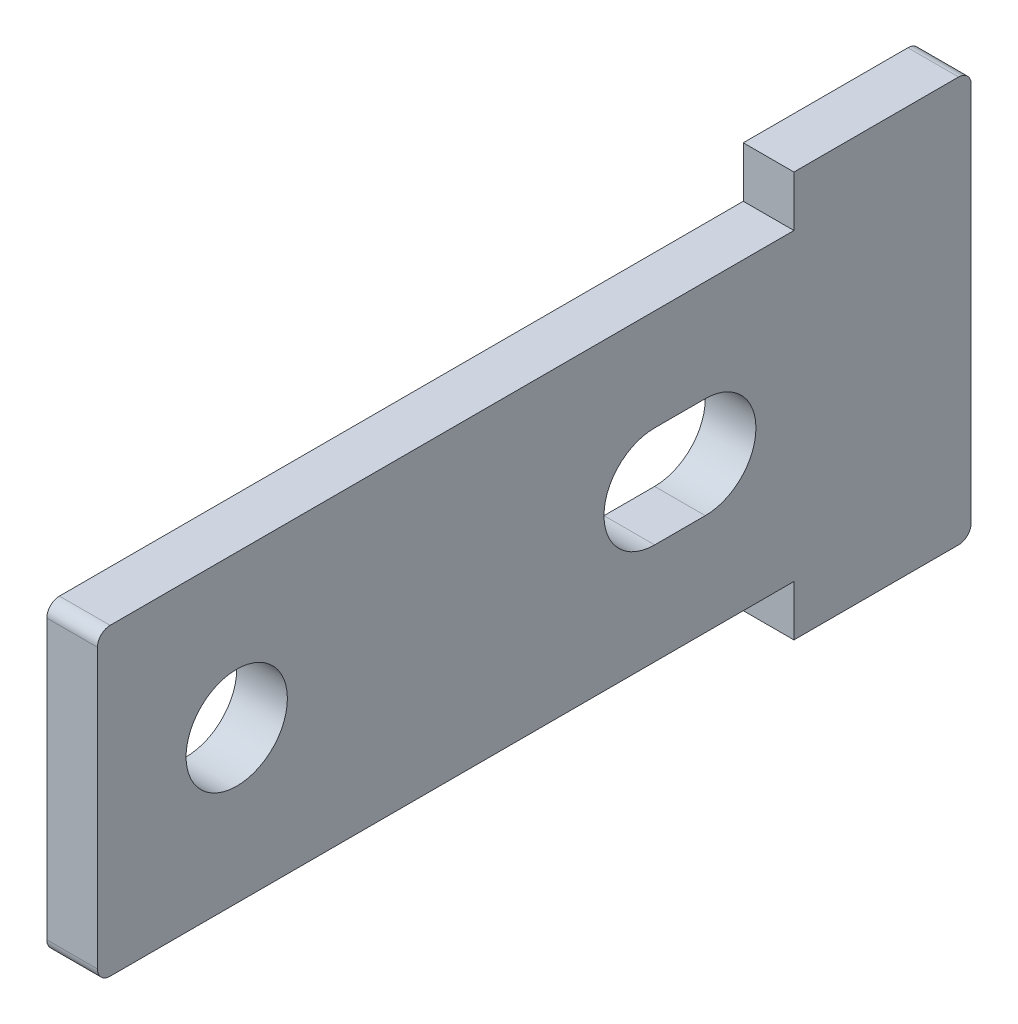
ISO-10303-21;
HEADER;
FILE_DESCRIPTION(('STEP AP214'),'2;1');
FILE_NAME('part.step','',(''),(''),'','','');
FILE_SCHEMA(('AUTOMOTIVE_DESIGN { 1 0 10303 214 1 1 1 1 }'));
ENDSEC;
DATA;
#1=APPLICATION_CONTEXT('core data for automotive mechanical design processes');
#2=APPLICATION_PROTOCOL_DEFINITION('international standard','automotive_design',2000,#1);
#3=PRODUCT_CONTEXT('',#1,'mechanical');
#4=PRODUCT('Part','Part','',(#3));
#5=PRODUCT_RELATED_PRODUCT_CATEGORY('part','',(#4));
#6=PRODUCT_DEFINITION_FORMATION('','',#4);
#7=PRODUCT_DEFINITION_CONTEXT('part definition',#1,'design');
#8=PRODUCT_DEFINITION('design','',#6,#7);
#9=PRODUCT_DEFINITION_SHAPE('','',#8);
#10=(LENGTH_UNIT() NAMED_UNIT(*) SI_UNIT(.MILLI.,.METRE.));
#11=(NAMED_UNIT(*) PLANE_ANGLE_UNIT() SI_UNIT($,.RADIAN.));
#12=(NAMED_UNIT(*) SI_UNIT($,.STERADIAN.) SOLID_ANGLE_UNIT());
#13=UNCERTAINTY_MEASURE_WITH_UNIT(LENGTH_MEASURE(1.E-05),#10,'distance_accuracy_value','');
#14=(GEOMETRIC_REPRESENTATION_CONTEXT(3) GLOBAL_UNCERTAINTY_ASSIGNED_CONTEXT((#13)) GLOBAL_UNIT_ASSIGNED_CONTEXT((#10,
#11,#12)) REPRESENTATION_CONTEXT('',''));
#15=CARTESIAN_POINT('',(0.,0.,0.));
#16=DIRECTION('',(0.,0.,1.));
#17=DIRECTION('',(1.,0.,0.));
#18=AXIS2_PLACEMENT_3D('',#15,#16,#17);
#19=CARTESIAN_POINT('',(2.,6.,34.5));
#20=DIRECTION('',(0.,0.,-1.));
#21=DIRECTION('',(-1.,0.,0.));
#22=AXIS2_PLACEMENT_3D('',#19,#20,#21);
#23=PLANE('',#22);
#24=DIRECTION('',(0.,-1.,0.));
#25=VECTOR('',#24,1.);
#26=CARTESIAN_POINT('',(0.,6.,34.5));
#27=LINE('',#26,#25);
#28=CARTESIAN_POINT('',(0.,5.5,34.5));
#29=VERTEX_POINT('',#28);
#30=CARTESIAN_POINT('',(0.,-5.5,34.5));
#31=VERTEX_POINT('',#30);
#32=EDGE_CURVE('E234',#29,#31,#27,.T.);
#33=ORIENTED_EDGE('',*,*,#32,.T.);
#34=DIRECTION('',(-1.,0.,0.));
#35=VECTOR('',#34,1.);
#36=CARTESIAN_POINT('',(2.,-5.5,34.5));
#37=LINE('',#36,#35);
#38=CARTESIAN_POINT('',(2.,-5.5,34.5));
#39=VERTEX_POINT('',#38);
#40=EDGE_CURVE('E54',#31,#39,#37,.F.);
#41=ORIENTED_EDGE('',*,*,#40,.T.);
#42=DIRECTION('',(0.,-1.,0.));
#43=VECTOR('',#42,1.);
#44=CARTESIAN_POINT('',(2.,6.,34.5));
#45=LINE('',#44,#43);
#46=CARTESIAN_POINT('',(2.,5.5,34.5));
#47=VERTEX_POINT('',#46);
#48=EDGE_CURVE('E204',#47,#39,#45,.T.);
#49=ORIENTED_EDGE('',*,*,#48,.F.);
#50=DIRECTION('',(-1.,0.,0.));
#51=VECTOR('',#50,1.);
#52=CARTESIAN_POINT('',(2.,5.5,34.5));
#53=LINE('',#52,#51);
#54=EDGE_CURVE('E318',#47,#29,#53,.T.);
#55=ORIENTED_EDGE('',*,*,#54,.T.);
#56=EDGE_LOOP('',(#33,#41,#49,#55));
#57=FACE_BOUND('',#56,.T.);
#58=ADVANCED_FACE('F45',(#57),#23,.F.);
#59=CARTESIAN_POINT('',(2.,-6.,34.5));
#60=DIRECTION('',(0.,1.,0.));
#61=DIRECTION('',(0.,0.,1.));
#62=AXIS2_PLACEMENT_3D('',#59,#60,#61);
#63=PLANE('',#62);
#64=DIRECTION('',(0.,0.,-1.));
#65=VECTOR('',#64,1.);
#66=CARTESIAN_POINT('',(2.,-6.,34.5));
#67=LINE('',#66,#65);
#68=CARTESIAN_POINT('',(2.,-6.,34.));
#69=VERTEX_POINT('',#68);
#70=CARTESIAN_POINT('',(2.,-6.,7.));
#71=VERTEX_POINT('',#70);
#72=EDGE_CURVE('E208',#69,#71,#67,.T.);
#73=ORIENTED_EDGE('',*,*,#72,.F.);
#74=DIRECTION('',(-1.,0.,0.));
#75=VECTOR('',#74,1.);
#76=CARTESIAN_POINT('',(2.,-6.,34.));
#77=LINE('',#76,#75);
#78=CARTESIAN_POINT('',(0.,-6.,34.));
#79=VERTEX_POINT('',#78);
#80=EDGE_CURVE('E314',#69,#79,#77,.T.);
#81=ORIENTED_EDGE('',*,*,#80,.T.);
#82=DIRECTION('',(0.,0.,-1.));
#83=VECTOR('',#82,1.);
#84=CARTESIAN_POINT('',(0.,-6.,34.5));
#85=LINE('',#84,#83);
#86=CARTESIAN_POINT('',(0.,-6.,7.));
#87=VERTEX_POINT('',#86);
#88=EDGE_CURVE('E238',#79,#87,#85,.T.);
#89=ORIENTED_EDGE('',*,*,#88,.T.);
#90=DIRECTION('',(-1.,0.,0.));
#91=VECTOR('',#90,1.);
#92=CARTESIAN_POINT('',(2.,-6.,7.));
#93=LINE('',#92,#91);
#94=EDGE_CURVE('E272',#71,#87,#93,.T.);
#95=ORIENTED_EDGE('',*,*,#94,.F.);
#96=EDGE_LOOP('',(#73,#81,#89,#95));
#97=FACE_BOUND('',#96,.T.);
#98=ADVANCED_FACE('F335',(#97),#63,.F.);
#99=CARTESIAN_POINT('',(2.,-6.,7.));
#100=DIRECTION('',(0.,0.,-1.));
#101=DIRECTION('',(-1.,0.,0.));
#102=AXIS2_PLACEMENT_3D('',#99,#100,#101);
#103=PLANE('',#102);
#104=DIRECTION('',(0.,-1.,0.));
#105=VECTOR('',#104,1.);
#106=CARTESIAN_POINT('',(0.,-6.,7.));
#107=LINE('',#106,#105);
#108=CARTESIAN_POINT('',(0.,-8.,7.));
#109=VERTEX_POINT('',#108);
#110=EDGE_CURVE('E241',#87,#109,#107,.T.);
#111=ORIENTED_EDGE('',*,*,#110,.T.);
#112=DIRECTION('',(-1.,0.,0.));
#113=VECTOR('',#112,1.);
#114=CARTESIAN_POINT('',(2.,-8.,7.));
#115=LINE('',#114,#113);
#116=CARTESIAN_POINT('',(2.,-8.,7.));
#117=VERTEX_POINT('',#116);
#118=EDGE_CURVE('E268',#117,#109,#115,.T.);
#119=ORIENTED_EDGE('',*,*,#118,.F.);
#120=DIRECTION('',(0.,-1.,0.));
#121=VECTOR('',#120,1.);
#122=CARTESIAN_POINT('',(2.,-6.,7.));
#123=LINE('',#122,#121);
#124=EDGE_CURVE('E212',#71,#117,#123,.T.);
#125=ORIENTED_EDGE('',*,*,#124,.F.);
#126=ORIENTED_EDGE('',*,*,#94,.T.);
#127=EDGE_LOOP('',(#111,#119,#125,#126));
#128=FACE_BOUND('',#127,.T.);
#129=ADVANCED_FACE('F344',(#128),#103,.F.);
#130=CARTESIAN_POINT('',(2.,-8.,7.));
#131=DIRECTION('',(0.,1.,0.));
#132=DIRECTION('',(0.,0.,1.));
#133=AXIS2_PLACEMENT_3D('',#130,#131,#132);
#134=PLANE('',#133);
#135=DIRECTION('',(0.,0.,-1.));
#136=VECTOR('',#135,1.);
#137=CARTESIAN_POINT('',(0.,-8.,7.));
#138=LINE('',#137,#136);
#139=CARTESIAN_POINT('',(0.,-8.,0.5));
#140=VERTEX_POINT('',#139);
#141=EDGE_CURVE('E244',#109,#140,#138,.T.);
#142=ORIENTED_EDGE('',*,*,#141,.T.);
#143=DIRECTION('',(-1.,0.,0.));
#144=VECTOR('',#143,1.);
#145=CARTESIAN_POINT('',(2.,-8.,0.5));
#146=LINE('',#145,#144);
#147=CARTESIAN_POINT('',(2.,-8.,0.5));
#148=VERTEX_POINT('',#147);
#149=EDGE_CURVE('E295',#140,#148,#146,.F.);
#150=ORIENTED_EDGE('',*,*,#149,.T.);
#151=DIRECTION('',(0.,0.,-1.));
#152=VECTOR('',#151,1.);
#153=CARTESIAN_POINT('',(2.,-8.,7.));
#154=LINE('',#153,#152);
#155=EDGE_CURVE('E215',#117,#148,#154,.T.);
#156=ORIENTED_EDGE('',*,*,#155,.F.);
#157=ORIENTED_EDGE('',*,*,#118,.T.);
#158=EDGE_LOOP('',(#142,#150,#156,#157));
#159=FACE_BOUND('',#158,.T.);
#160=ADVANCED_FACE('F348',(#159),#134,.F.);
#161=CARTESIAN_POINT('',(2.,0.,0.));
#162=DIRECTION('',(0.,0.,1.));
#163=DIRECTION('',(1.,0.,0.));
#164=AXIS2_PLACEMENT_3D('',#161,#162,#163);
#165=PLANE('',#164);
#166=DIRECTION('',(0.,1.,0.));
#167=VECTOR('',#166,1.);
#168=CARTESIAN_POINT('',(2.,-8.,0.));
#169=LINE('',#168,#167);
#170=CARTESIAN_POINT('',(2.,-7.5,0.));
#171=VERTEX_POINT('',#170);
#172=CARTESIAN_POINT('',(2.,7.5,0.));
#173=VERTEX_POINT('',#172);
#174=EDGE_CURVE('E219',#171,#173,#169,.T.);
#175=ORIENTED_EDGE('',*,*,#174,.F.);
#176=DIRECTION('',(-1.,0.,0.));
#177=VECTOR('',#176,1.);
#178=CARTESIAN_POINT('',(2.,-7.5,0.));
#179=LINE('',#178,#177);
#180=CARTESIAN_POINT('',(0.,-7.5,0.));
#181=VERTEX_POINT('',#180);
#182=EDGE_CURVE('E279',#171,#181,#179,.T.);
#183=ORIENTED_EDGE('',*,*,#182,.T.);
#184=DIRECTION('',(0.,1.,0.));
#185=VECTOR('',#184,1.);
#186=CARTESIAN_POINT('',(0.,0.,0.));
#187=LINE('',#186,#185);
#188=CARTESIAN_POINT('',(0.,7.5,0.));
#189=VERTEX_POINT('',#188);
#190=EDGE_CURVE('E248',#181,#189,#187,.T.);
#191=ORIENTED_EDGE('',*,*,#190,.T.);
#192=DIRECTION('',(-1.,0.,0.));
#193=VECTOR('',#192,1.);
#194=CARTESIAN_POINT('',(2.,7.5,0.));
#195=LINE('',#194,#193);
#196=EDGE_CURVE('E276',#189,#173,#195,.F.);
#197=ORIENTED_EDGE('',*,*,#196,.T.);
#198=EDGE_LOOP('',(#175,#183,#191,#197));
#199=FACE_BOUND('',#198,.T.);
#200=ADVANCED_FACE('F356',(#199),#165,.F.);
#201=CARTESIAN_POINT('',(2.,8.,0.));
#202=DIRECTION('',(0.,-1.,0.));
#203=DIRECTION('',(0.,0.,-1.));
#204=AXIS2_PLACEMENT_3D('',#201,#202,#203);
#205=PLANE('',#204);
#206=DIRECTION('',(0.,0.,1.));
#207=VECTOR('',#206,1.);
#208=CARTESIAN_POINT('',(2.,8.,0.));
#209=LINE('',#208,#207);
#210=CARTESIAN_POINT('',(2.,8.,0.5));
#211=VERTEX_POINT('',#210);
#212=CARTESIAN_POINT('',(2.,8.,7.));
#213=VERTEX_POINT('',#212);
#214=EDGE_CURVE('E223',#211,#213,#209,.T.);
#215=ORIENTED_EDGE('',*,*,#214,.F.);
#216=DIRECTION('',(-1.,0.,0.));
#217=VECTOR('',#216,1.);
#218=CARTESIAN_POINT('',(2.,8.,0.5));
#219=LINE('',#218,#217);
#220=CARTESIAN_POINT('',(0.,8.,0.5));
#221=VERTEX_POINT('',#220);
#222=EDGE_CURVE('E310',#211,#221,#219,.T.);
#223=ORIENTED_EDGE('',*,*,#222,.T.);
#224=DIRECTION('',(0.,0.,1.));
#225=VECTOR('',#224,1.);
#226=CARTESIAN_POINT('',(0.,8.,0.));
#227=LINE('',#226,#225);
#228=CARTESIAN_POINT('',(0.,8.,7.));
#229=VERTEX_POINT('',#228);
#230=EDGE_CURVE('E252',#221,#229,#227,.T.);
#231=ORIENTED_EDGE('',*,*,#230,.T.);
#232=DIRECTION('',(-1.,0.,0.));
#233=VECTOR('',#232,1.);
#234=CARTESIAN_POINT('',(2.,8.,7.));
#235=LINE('',#234,#233);
#236=EDGE_CURVE('E264',#213,#229,#235,.T.);
#237=ORIENTED_EDGE('',*,*,#236,.F.);
#238=EDGE_LOOP('',(#215,#223,#231,#237));
#239=FACE_BOUND('',#238,.T.);
#240=ADVANCED_FACE('F366',(#239),#205,.F.);
#241=CARTESIAN_POINT('',(2.,8.,7.));
#242=DIRECTION('',(0.,0.,-1.));
#243=DIRECTION('',(-1.,0.,0.));
#244=AXIS2_PLACEMENT_3D('',#241,#242,#243);
#245=PLANE('',#244);
#246=DIRECTION('',(0.,-1.,0.));
#247=VECTOR('',#246,1.);
#248=CARTESIAN_POINT('',(0.,8.,7.));
#249=LINE('',#248,#247);
#250=CARTESIAN_POINT('',(0.,6.,7.));
#251=VERTEX_POINT('',#250);
#252=EDGE_CURVE('E255',#229,#251,#249,.T.);
#253=ORIENTED_EDGE('',*,*,#252,.T.);
#254=DIRECTION('',(-1.,0.,0.));
#255=VECTOR('',#254,1.);
#256=CARTESIAN_POINT('',(2.,6.,7.));
#257=LINE('',#256,#255);
#258=CARTESIAN_POINT('',(2.,6.,7.));
#259=VERTEX_POINT('',#258);
#260=EDGE_CURVE('E233',#259,#251,#257,.T.);
#261=ORIENTED_EDGE('',*,*,#260,.F.);
#262=DIRECTION('',(0.,-1.,0.));
#263=VECTOR('',#262,1.);
#264=CARTESIAN_POINT('',(2.,8.,7.));
#265=LINE('',#264,#263);
#266=EDGE_CURVE('E226',#213,#259,#265,.T.);
#267=ORIENTED_EDGE('',*,*,#266,.F.);
#268=ORIENTED_EDGE('',*,*,#236,.T.);
#269=EDGE_LOOP('',(#253,#261,#267,#268));
#270=FACE_BOUND('',#269,.T.);
#271=ADVANCED_FACE('F372',(#270),#245,.F.);
#272=CARTESIAN_POINT('',(2.,6.,7.));
#273=DIRECTION('',(0.,-1.,0.));
#274=DIRECTION('',(0.,0.,-1.));
#275=AXIS2_PLACEMENT_3D('',#272,#273,#274);
#276=PLANE('',#275);
#277=DIRECTION('',(0.,0.,1.));
#278=VECTOR('',#277,1.);
#279=CARTESIAN_POINT('',(0.,6.,7.));
#280=LINE('',#279,#278);
#281=CARTESIAN_POINT('',(0.,6.,34.));
#282=VERTEX_POINT('',#281);
#283=EDGE_CURVE('E209',#251,#282,#280,.T.);
#284=ORIENTED_EDGE('',*,*,#283,.T.);
#285=DIRECTION('',(-1.,0.,0.));
#286=VECTOR('',#285,1.);
#287=CARTESIAN_POINT('',(2.,6.,34.));
#288=LINE('',#287,#286);
#289=CARTESIAN_POINT('',(2.,6.,34.));
#290=VERTEX_POINT('',#289);
#291=EDGE_CURVE('E11',#282,#290,#288,.F.);
#292=ORIENTED_EDGE('',*,*,#291,.T.);
#293=DIRECTION('',(0.,0.,1.));
#294=VECTOR('',#293,1.);
#295=CARTESIAN_POINT('',(2.,6.,7.));
#296=LINE('',#295,#294);
#297=EDGE_CURVE('E229',#259,#290,#296,.T.);
#298=ORIENTED_EDGE('',*,*,#297,.F.);
#299=ORIENTED_EDGE('',*,*,#260,.T.);
#300=EDGE_LOOP('',(#284,#292,#298,#299));
#301=FACE_BOUND('',#300,.T.);
#302=ADVANCED_FACE('F375',(#301),#276,.F.);
#303=CARTESIAN_POINT('',(2.,0.,0.));
#304=DIRECTION('',(1.,0.,0.));
#305=DIRECTION('',(0.,0.,-1.));
#306=AXIS2_PLACEMENT_3D('',#303,#304,#305);
#307=PLANE('',#306);
#308=CARTESIAN_POINT('',(2.,0.,29.));
#309=DIRECTION('',(1.,0.,0.));
#310=DIRECTION('',(0.,0.,-1.));
#311=AXIS2_PLACEMENT_3D('',#308,#309,#310);
#312=CIRCLE('',#311,2.);
#313=CARTESIAN_POINT('',(2.,0.,27.));
#314=VERTEX_POINT('',#313);
#315=EDGE_CURVE('E182',#314,#314,#312,.T.);
#316=ORIENTED_EDGE('',*,*,#315,.F.);
#317=EDGE_LOOP('',(#316));
#318=FACE_BOUND('',#317,.T.);
#319=CARTESIAN_POINT('',(2.,0.,12.5));
#320=DIRECTION('',(1.,0.,0.));
#321=DIRECTION('',(0.,0.,-1.));
#322=AXIS2_PLACEMENT_3D('',#319,#320,#321);
#323=CIRCLE('',#322,2.);
#324=CARTESIAN_POINT('',(2.,2.,12.5));
#325=VERTEX_POINT('',#324);
#326=CARTESIAN_POINT('',(2.,-2.,12.5));
#327=VERTEX_POINT('',#326);
#328=EDGE_CURVE('E61',#325,#327,#323,.T.);
#329=ORIENTED_EDGE('',*,*,#328,.F.);
#330=DIRECTION('',(0.,0.,1.));
#331=VECTOR('',#330,1.);
#332=CARTESIAN_POINT('',(2.,2.,12.5));
#333=LINE('',#332,#331);
#334=CARTESIAN_POINT('',(2.,2.,10.5));
#335=VERTEX_POINT('',#334);
#336=EDGE_CURVE('E168',#335,#325,#333,.T.);
#337=ORIENTED_EDGE('',*,*,#336,.F.);
#338=CARTESIAN_POINT('',(2.,0.,10.5));
#339=DIRECTION('',(1.,0.,0.));
#340=DIRECTION('',(0.,0.,1.));
#341=AXIS2_PLACEMENT_3D('',#338,#339,#340);
#342=CIRCLE('',#341,2.);
#343=CARTESIAN_POINT('',(2.,-2.,10.5));
#344=VERTEX_POINT('',#343);
#345=EDGE_CURVE('E174',#344,#335,#342,.T.);
#346=ORIENTED_EDGE('',*,*,#345,.F.);
#347=DIRECTION('',(0.,0.,-1.));
#348=VECTOR('',#347,1.);
#349=CARTESIAN_POINT('',(2.,-2.,12.5));
#350=LINE('',#349,#348);
#351=EDGE_CURVE('E180',#327,#344,#350,.T.);
#352=ORIENTED_EDGE('',*,*,#351,.F.);
#353=EDGE_LOOP('',(#329,#337,#346,#352));
#354=FACE_BOUND('',#353,.T.);
#355=ORIENTED_EDGE('',*,*,#155,.T.);
#356=CARTESIAN_POINT('',(2.,-7.5,0.5));
#357=DIRECTION('',(1.,0.,0.));
#358=DIRECTION('',(0.,0.,-1.));
#359=AXIS2_PLACEMENT_3D('',#356,#357,#358);
#360=CIRCLE('',#359,0.5);
#361=EDGE_CURVE('E307',#148,#171,#360,.T.);
#362=ORIENTED_EDGE('',*,*,#361,.T.);
#363=ORIENTED_EDGE('',*,*,#174,.T.);
#364=CARTESIAN_POINT('',(2.,7.5,0.5));
#365=DIRECTION('',(1.,0.,0.));
#366=DIRECTION('',(0.,0.,-1.));
#367=AXIS2_PLACEMENT_3D('',#364,#365,#366);
#368=CIRCLE('',#367,0.5);
#369=EDGE_CURVE('E304',#173,#211,#368,.T.);
#370=ORIENTED_EDGE('',*,*,#369,.T.);
#371=ORIENTED_EDGE('',*,*,#214,.T.);
#372=ORIENTED_EDGE('',*,*,#266,.T.);
#373=ORIENTED_EDGE('',*,*,#297,.T.);
#374=CARTESIAN_POINT('',(2.,5.5,34.));
#375=DIRECTION('',(1.,0.,0.));
#376=DIRECTION('',(0.,0.,-1.));
#377=AXIS2_PLACEMENT_3D('',#374,#375,#376);
#378=CIRCLE('',#377,0.5);
#379=EDGE_CURVE('E298',#290,#47,#378,.T.);
#380=ORIENTED_EDGE('',*,*,#379,.T.);
#381=ORIENTED_EDGE('',*,*,#48,.T.);
#382=CARTESIAN_POINT('',(2.,-5.5,34.));
#383=DIRECTION('',(1.,0.,0.));
#384=DIRECTION('',(0.,0.,-1.));
#385=AXIS2_PLACEMENT_3D('',#382,#383,#384);
#386=CIRCLE('',#385,0.5);
#387=EDGE_CURVE('E301',#39,#69,#386,.T.);
#388=ORIENTED_EDGE('',*,*,#387,.T.);
#389=ORIENTED_EDGE('',*,*,#72,.T.);
#390=ORIENTED_EDGE('',*,*,#124,.T.);
#391=EDGE_LOOP('',(#355,#362,#363,#370,#371,#372,#373,#380,#381,#388,#389,#390));
#392=FACE_BOUND('',#391,.T.);
#393=ADVANCED_FACE('F177',(#318,#354,#392),#307,.T.);
#394=CARTESIAN_POINT('',(0.,0.,0.));
#395=DIRECTION('',(1.,0.,0.));
#396=DIRECTION('',(0.,0.,-1.));
#397=AXIS2_PLACEMENT_3D('',#394,#395,#396);
#398=PLANE('',#397);
#399=CARTESIAN_POINT('',(0.,0.,29.));
#400=DIRECTION('',(1.,0.,0.));
#401=DIRECTION('',(0.,0.,-1.));
#402=AXIS2_PLACEMENT_3D('',#399,#400,#401);
#403=CIRCLE('',#402,2.);
#404=CARTESIAN_POINT('',(0.,0.,27.));
#405=VERTEX_POINT('',#404);
#406=EDGE_CURVE('E187',#405,#405,#403,.T.);
#407=ORIENTED_EDGE('',*,*,#406,.T.);
#408=EDGE_LOOP('',(#407));
#409=FACE_BOUND('',#408,.T.);
#410=DIRECTION('',(0.,0.,1.));
#411=VECTOR('',#410,1.);
#412=CARTESIAN_POINT('',(0.,2.,12.5));
#413=LINE('',#412,#411);
#414=CARTESIAN_POINT('',(0.,2.,10.5));
#415=VERTEX_POINT('',#414);
#416=CARTESIAN_POINT('',(0.,2.,12.5));
#417=VERTEX_POINT('',#416);
#418=EDGE_CURVE('E192',#415,#417,#413,.T.);
#419=ORIENTED_EDGE('',*,*,#418,.T.);
#420=CARTESIAN_POINT('',(0.,0.,12.5));
#421=DIRECTION('',(1.,0.,0.));
#422=DIRECTION('',(0.,0.,-1.));
#423=AXIS2_PLACEMENT_3D('',#420,#421,#422);
#424=CIRCLE('',#423,2.);
#425=CARTESIAN_POINT('',(0.,-2.,12.5));
#426=VERTEX_POINT('',#425);
#427=EDGE_CURVE('E160',#417,#426,#424,.T.);
#428=ORIENTED_EDGE('',*,*,#427,.T.);
#429=DIRECTION('',(0.,0.,-1.));
#430=VECTOR('',#429,1.);
#431=CARTESIAN_POINT('',(0.,-2.,12.5));
#432=LINE('',#431,#430);
#433=CARTESIAN_POINT('',(0.,-2.,10.5));
#434=VERTEX_POINT('',#433);
#435=EDGE_CURVE('E198',#426,#434,#432,.T.);
#436=ORIENTED_EDGE('',*,*,#435,.T.);
#437=CARTESIAN_POINT('',(0.,0.,10.5));
#438=DIRECTION('',(1.,0.,0.));
#439=DIRECTION('',(0.,0.,1.));
#440=AXIS2_PLACEMENT_3D('',#437,#438,#439);
#441=CIRCLE('',#440,2.);
#442=EDGE_CURVE('E69',#434,#415,#441,.T.);
#443=ORIENTED_EDGE('',*,*,#442,.T.);
#444=EDGE_LOOP('',(#419,#428,#436,#443));
#445=FACE_BOUND('',#444,.T.);
#446=ORIENTED_EDGE('',*,*,#190,.F.);
#447=CARTESIAN_POINT('',(0.,-7.5,0.5));
#448=DIRECTION('',(1.,0.,0.));
#449=DIRECTION('',(0.,0.,-1.));
#450=AXIS2_PLACEMENT_3D('',#447,#448,#449);
#451=CIRCLE('',#450,0.5);
#452=EDGE_CURVE('E292',#181,#140,#451,.F.);
#453=ORIENTED_EDGE('',*,*,#452,.T.);
#454=ORIENTED_EDGE('',*,*,#141,.F.);
#455=ORIENTED_EDGE('',*,*,#110,.F.);
#456=ORIENTED_EDGE('',*,*,#88,.F.);
#457=CARTESIAN_POINT('',(0.,-5.5,34.));
#458=DIRECTION('',(1.,0.,0.));
#459=DIRECTION('',(0.,0.,-1.));
#460=AXIS2_PLACEMENT_3D('',#457,#458,#459);
#461=CIRCLE('',#460,0.5);
#462=EDGE_CURVE('E286',#79,#31,#461,.F.);
#463=ORIENTED_EDGE('',*,*,#462,.T.);
#464=ORIENTED_EDGE('',*,*,#32,.F.);
#465=CARTESIAN_POINT('',(0.,5.5,34.));
#466=DIRECTION('',(1.,0.,0.));
#467=DIRECTION('',(0.,0.,-1.));
#468=AXIS2_PLACEMENT_3D('',#465,#466,#467);
#469=CIRCLE('',#468,0.5);
#470=EDGE_CURVE('E283',#29,#282,#469,.F.);
#471=ORIENTED_EDGE('',*,*,#470,.T.);
#472=ORIENTED_EDGE('',*,*,#283,.F.);
#473=ORIENTED_EDGE('',*,*,#252,.F.);
#474=ORIENTED_EDGE('',*,*,#230,.F.);
#475=CARTESIAN_POINT('',(0.,7.5,0.5));
#476=DIRECTION('',(1.,0.,0.));
#477=DIRECTION('',(0.,0.,-1.));
#478=AXIS2_PLACEMENT_3D('',#475,#476,#477);
#479=CIRCLE('',#478,0.5);
#480=EDGE_CURVE('E289',#221,#189,#479,.F.);
#481=ORIENTED_EDGE('',*,*,#480,.T.);
#482=EDGE_LOOP('',(#446,#453,#454,#455,#456,#463,#464,#471,#472,#473,#474,#481));
#483=FACE_BOUND('',#482,.T.);
#484=ADVANCED_FACE('F340',(#409,#445,#483),#398,.F.);
#485=CARTESIAN_POINT('',(2.,-7.5,0.5));
#486=DIRECTION('',(-1.,0.,0.));
#487=DIRECTION('',(0.,0.,1.));
#488=AXIS2_PLACEMENT_3D('',#485,#486,#487);
#489=CYLINDRICAL_SURFACE('',#488,0.5);
#490=ORIENTED_EDGE('',*,*,#361,.F.);
#491=ORIENTED_EDGE('',*,*,#149,.F.);
#492=ORIENTED_EDGE('',*,*,#452,.F.);
#493=ORIENTED_EDGE('',*,*,#182,.F.);
#494=EDGE_LOOP('',(#490,#491,#492,#493));
#495=FACE_BOUND('',#494,.T.);
#496=ADVANCED_FACE('F354',(#495),#489,.T.);
#497=CARTESIAN_POINT('',(2.,7.5,0.5));
#498=DIRECTION('',(-1.,0.,0.));
#499=DIRECTION('',(0.,0.,1.));
#500=AXIS2_PLACEMENT_3D('',#497,#498,#499);
#501=CYLINDRICAL_SURFACE('',#500,0.5);
#502=ORIENTED_EDGE('',*,*,#369,.F.);
#503=ORIENTED_EDGE('',*,*,#196,.F.);
#504=ORIENTED_EDGE('',*,*,#480,.F.);
#505=ORIENTED_EDGE('',*,*,#222,.F.);
#506=EDGE_LOOP('',(#502,#503,#504,#505));
#507=FACE_BOUND('',#506,.T.);
#508=ADVANCED_FACE('F363',(#507),#501,.T.);
#509=CARTESIAN_POINT('',(2.,-5.5,34.));
#510=DIRECTION('',(-1.,0.,0.));
#511=DIRECTION('',(0.,0.,1.));
#512=AXIS2_PLACEMENT_3D('',#509,#510,#511);
#513=CYLINDRICAL_SURFACE('',#512,0.5);
#514=ORIENTED_EDGE('',*,*,#387,.F.);
#515=ORIENTED_EDGE('',*,*,#40,.F.);
#516=ORIENTED_EDGE('',*,*,#462,.F.);
#517=ORIENTED_EDGE('',*,*,#80,.F.);
#518=EDGE_LOOP('',(#514,#515,#516,#517));
#519=FACE_BOUND('',#518,.T.);
#520=ADVANCED_FACE('F332',(#519),#513,.T.);
#521=CARTESIAN_POINT('',(2.,5.5,34.));
#522=DIRECTION('',(-1.,0.,0.));
#523=DIRECTION('',(0.,0.,1.));
#524=AXIS2_PLACEMENT_3D('',#521,#522,#523);
#525=CYLINDRICAL_SURFACE('',#524,0.5);
#526=ORIENTED_EDGE('',*,*,#379,.F.);
#527=ORIENTED_EDGE('',*,*,#291,.F.);
#528=ORIENTED_EDGE('',*,*,#470,.F.);
#529=ORIENTED_EDGE('',*,*,#54,.F.);
#530=EDGE_LOOP('',(#526,#527,#528,#529));
#531=FACE_BOUND('',#530,.T.);
#532=ADVANCED_FACE('F47',(#531),#525,.T.);
#533=CARTESIAN_POINT('',(0.,0.,12.5));
#534=DIRECTION('',(1.,0.,0.));
#535=DIRECTION('',(0.,0.,-1.));
#536=AXIS2_PLACEMENT_3D('',#533,#534,#535);
#537=CYLINDRICAL_SURFACE('',#536,2.);
#538=ORIENTED_EDGE('',*,*,#328,.T.);
#539=DIRECTION('',(1.,0.,0.));
#540=VECTOR('',#539,1.);
#541=CARTESIAN_POINT('',(0.,-2.,12.5));
#542=LINE('',#541,#540);
#543=EDGE_CURVE('E195',#426,#327,#542,.T.);
#544=ORIENTED_EDGE('',*,*,#543,.F.);
#545=ORIENTED_EDGE('',*,*,#427,.F.);
#546=DIRECTION('',(1.,0.,0.));
#547=VECTOR('',#546,1.);
#548=CARTESIAN_POINT('',(0.,2.,12.5));
#549=LINE('',#548,#547);
#550=EDGE_CURVE('E156',#417,#325,#549,.T.);
#551=ORIENTED_EDGE('',*,*,#550,.T.);
#552=EDGE_LOOP('',(#538,#544,#545,#551));
#553=FACE_BOUND('',#552,.T.);
#554=ADVANCED_FACE('F158',(#553),#537,.F.);
#555=CARTESIAN_POINT('',(0.,2.,12.5));
#556=DIRECTION('',(0.,1.,0.));
#557=DIRECTION('',(0.,0.,1.));
#558=AXIS2_PLACEMENT_3D('',#555,#556,#557);
#559=PLANE('',#558);
#560=ORIENTED_EDGE('',*,*,#336,.T.);
#561=ORIENTED_EDGE('',*,*,#550,.F.);
#562=ORIENTED_EDGE('',*,*,#418,.F.);
#563=DIRECTION('',(1.,0.,0.));
#564=VECTOR('',#563,1.);
#565=CARTESIAN_POINT('',(0.,2.,10.5));
#566=LINE('',#565,#564);
#567=EDGE_CURVE('E165',#415,#335,#566,.T.);
#568=ORIENTED_EDGE('',*,*,#567,.T.);
#569=EDGE_LOOP('',(#560,#561,#562,#568));
#570=FACE_BOUND('',#569,.T.);
#571=ADVANCED_FACE('F169',(#570),#559,.F.);
#572=CARTESIAN_POINT('',(0.,0.,10.5));
#573=DIRECTION('',(1.,0.,0.));
#574=DIRECTION('',(0.,0.,-1.));
#575=AXIS2_PLACEMENT_3D('',#572,#573,#574);
#576=CYLINDRICAL_SURFACE('',#575,2.);
#577=ORIENTED_EDGE('',*,*,#345,.T.);
#578=ORIENTED_EDGE('',*,*,#567,.F.);
#579=ORIENTED_EDGE('',*,*,#442,.F.);
#580=DIRECTION('',(1.,0.,0.));
#581=VECTOR('',#580,1.);
#582=CARTESIAN_POINT('',(0.,-2.,10.5));
#583=LINE('',#582,#581);
#584=EDGE_CURVE('E543',#434,#344,#583,.T.);
#585=ORIENTED_EDGE('',*,*,#584,.T.);
#586=EDGE_LOOP('',(#577,#578,#579,#585));
#587=FACE_BOUND('',#586,.T.);
#588=ADVANCED_FACE('F428',(#587),#576,.F.);
#589=CARTESIAN_POINT('',(0.,-2.,12.5));
#590=DIRECTION('',(0.,-1.,0.));
#591=DIRECTION('',(0.,0.,-1.));
#592=AXIS2_PLACEMENT_3D('',#589,#590,#591);
#593=PLANE('',#592);
#594=ORIENTED_EDGE('',*,*,#351,.T.);
#595=ORIENTED_EDGE('',*,*,#584,.F.);
#596=ORIENTED_EDGE('',*,*,#435,.F.);
#597=ORIENTED_EDGE('',*,*,#543,.T.);
#598=EDGE_LOOP('',(#594,#595,#596,#597));
#599=FACE_BOUND('',#598,.T.);
#600=ADVANCED_FACE('F437',(#599),#593,.F.);
#601=CARTESIAN_POINT('',(0.,0.,29.));
#602=DIRECTION('',(1.,0.,0.));
#603=DIRECTION('',(0.,0.,-1.));
#604=AXIS2_PLACEMENT_3D('',#601,#602,#603);
#605=CYLINDRICAL_SURFACE('',#604,2.);
#606=ORIENTED_EDGE('',*,*,#406,.F.);
#607=EDGE_LOOP('',(#606));
#608=FACE_BOUND('',#607,.T.);
#609=ORIENTED_EDGE('',*,*,#315,.T.);
#610=EDGE_LOOP('',(#609));
#611=FACE_BOUND('',#610,.T.);
#612=ADVANCED_FACE('F446',(#608,#611),#605,.F.);
#613=CLOSED_SHELL('',(#58,#98,#129,#160,#200,#240,#271,#302,#393,#484,#496,#508,#520,#532,#554,
#571,#588,#600,#612));
#614=MANIFOLD_SOLID_BREP('B2',#613);
#615=ADVANCED_BREP_SHAPE_REPRESENTATION('',(#18,#614),#14);
#616=SHAPE_DEFINITION_REPRESENTATION(#9,#615);
ENDSEC;
END-ISO-10303-21;
